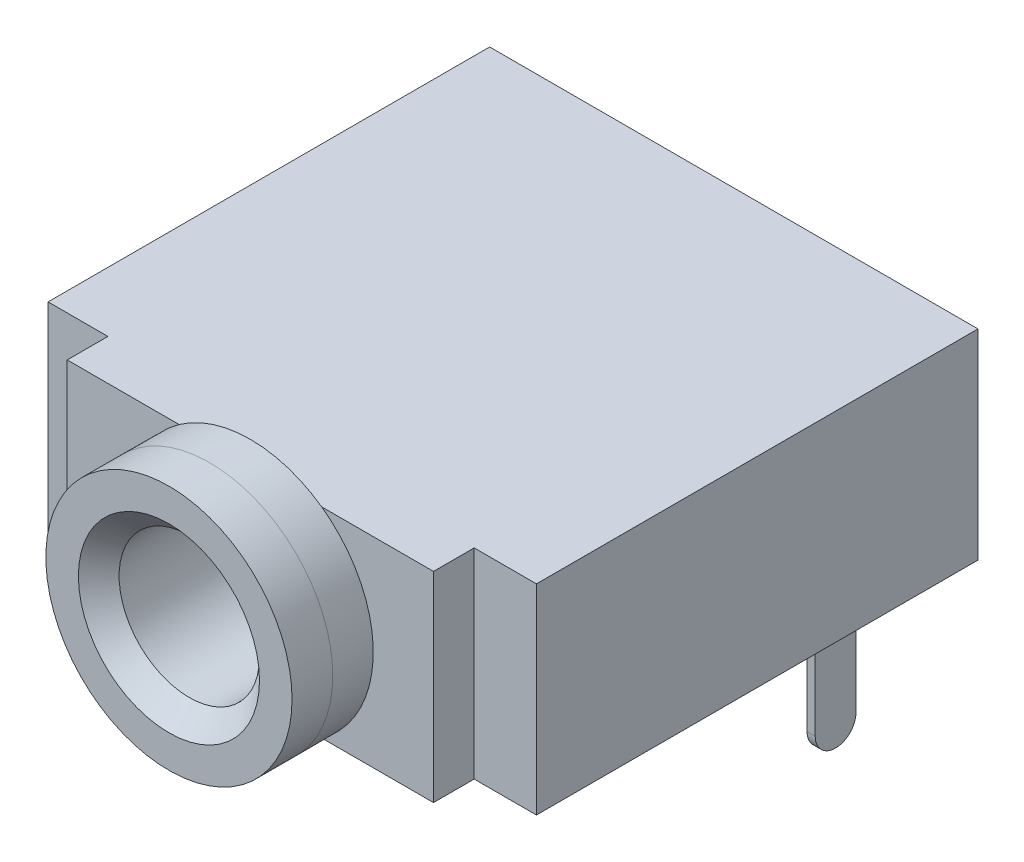
ISO-10303-21;
HEADER;
FILE_DESCRIPTION(('STEP AP214'),'2;1');
FILE_NAME('part.step','',(''),(''),'','','');
FILE_SCHEMA(('AUTOMOTIVE_DESIGN { 1 0 10303 214 1 1 1 1 }'));
ENDSEC;
DATA;
#1=APPLICATION_CONTEXT('core data for automotive mechanical design processes');
#2=APPLICATION_PROTOCOL_DEFINITION('international standard','automotive_design',2000,#1);
#3=PRODUCT_CONTEXT('',#1,'mechanical');
#4=PRODUCT('Part','Part','',(#3));
#5=PRODUCT_RELATED_PRODUCT_CATEGORY('part','',(#4));
#6=PRODUCT_DEFINITION_FORMATION('','',#4);
#7=PRODUCT_DEFINITION_CONTEXT('part definition',#1,'design');
#8=PRODUCT_DEFINITION('design','',#6,#7);
#9=PRODUCT_DEFINITION_SHAPE('','',#8);
#10=(LENGTH_UNIT() NAMED_UNIT(*) SI_UNIT(.MILLI.,.METRE.));
#11=(NAMED_UNIT(*) PLANE_ANGLE_UNIT() SI_UNIT($,.RADIAN.));
#12=(NAMED_UNIT(*) SI_UNIT($,.STERADIAN.) SOLID_ANGLE_UNIT());
#13=UNCERTAINTY_MEASURE_WITH_UNIT(LENGTH_MEASURE(1.E-05),#10,'distance_accuracy_value','');
#14=(GEOMETRIC_REPRESENTATION_CONTEXT(3) GLOBAL_UNCERTAINTY_ASSIGNED_CONTEXT((#13)) GLOBAL_UNIT_ASSIGNED_CONTEXT((#10,
#11,#12)) REPRESENTATION_CONTEXT('',''));
#15=CARTESIAN_POINT('',(0.,0.,0.));
#16=DIRECTION('',(0.,0.,1.));
#17=DIRECTION('',(1.,0.,0.));
#18=AXIS2_PLACEMENT_3D('',#15,#16,#17);
#19=CARTESIAN_POINT('',(5.48177215189873,-3.25,-3.45));
#20=DIRECTION('',(0.,0.,-1.));
#21=DIRECTION('',(-1.,0.,0.));
#22=AXIS2_PLACEMENT_3D('',#19,#20,#21);
#23=PLANE('',#22);
#24=CARTESIAN_POINT('',(5.98177215189874,-2.75,-3.45));
#25=DIRECTION('',(0.,0.,-1.));
#26=DIRECTION('',(1.,0.,0.));
#27=AXIS2_PLACEMENT_3D('',#24,#25,#26);
#28=CIRCLE('',#27,0.5);
#29=CARTESIAN_POINT('',(6.48177215189874,-2.75,-3.45));
#30=VERTEX_POINT('',#29);
#31=CARTESIAN_POINT('',(5.48177215189874,-2.75,-3.45));
#32=VERTEX_POINT('',#31);
#33=EDGE_CURVE('E253',#30,#32,#28,.T.);
#34=ORIENTED_EDGE('',*,*,#33,.F.);
#35=DIRECTION('',(0.,1.,0.));
#36=VECTOR('',#35,1.);
#37=CARTESIAN_POINT('',(6.48177215189873,-3.25,-3.45));
#38=LINE('',#37,#36);
#39=CARTESIAN_POINT('',(6.48177215189873,0.,-3.45));
#40=VERTEX_POINT('',#39);
#41=EDGE_CURVE('E260',#30,#40,#38,.T.);
#42=ORIENTED_EDGE('',*,*,#41,.T.);
#43=DIRECTION('',(-1.,0.,0.));
#44=VECTOR('',#43,1.);
#45=CARTESIAN_POINT('',(5.48177215189873,0.,-3.45));
#46=LINE('',#45,#44);
#47=CARTESIAN_POINT('',(5.48177215189873,0.,-3.45));
#48=VERTEX_POINT('',#47);
#49=EDGE_CURVE('E971',#40,#48,#46,.T.);
#50=ORIENTED_EDGE('',*,*,#49,.T.);
#51=DIRECTION('',(0.,1.,0.));
#52=VECTOR('',#51,1.);
#53=CARTESIAN_POINT('',(5.48177215189873,-3.25,-3.45));
#54=LINE('',#53,#52);
#55=EDGE_CURVE('E268',#32,#48,#54,.T.);
#56=ORIENTED_EDGE('',*,*,#55,.F.);
#57=EDGE_LOOP('',(#34,#42,#50,#56));
#58=FACE_BOUND('',#57,.T.);
#59=ADVANCED_FACE('F43',(#58),#23,.F.);
#60=CARTESIAN_POINT('',(5.48177215189873,-3.25,-3.65));
#61=DIRECTION('',(1.,0.,0.));
#62=DIRECTION('',(0.,0.,-1.));
#63=AXIS2_PLACEMENT_3D('',#60,#61,#62);
#64=PLANE('',#63);
#65=DIRECTION('',(0.,0.,1.));
#66=VECTOR('',#65,1.);
#67=CARTESIAN_POINT('',(5.48177215189874,-2.75,-10.851));
#68=LINE('',#67,#66);
#69=CARTESIAN_POINT('',(5.48177215189874,-2.75,-3.65));
#70=VERTEX_POINT('',#69);
#71=EDGE_CURVE('E249',#70,#32,#68,.T.);
#72=ORIENTED_EDGE('',*,*,#71,.T.);
#73=ORIENTED_EDGE('',*,*,#55,.T.);
#74=DIRECTION('',(0.,0.,-1.));
#75=VECTOR('',#74,1.);
#76=CARTESIAN_POINT('',(5.48177215189873,0.,-3.65));
#77=LINE('',#76,#75);
#78=CARTESIAN_POINT('',(5.48177215189873,0.,-3.65));
#79=VERTEX_POINT('',#78);
#80=EDGE_CURVE('E270',#48,#79,#77,.T.);
#81=ORIENTED_EDGE('',*,*,#80,.T.);
#82=DIRECTION('',(0.,1.,0.));
#83=VECTOR('',#82,1.);
#84=CARTESIAN_POINT('',(5.48177215189873,-3.25,-3.65));
#85=LINE('',#84,#83);
#86=EDGE_CURVE('E266',#70,#79,#85,.T.);
#87=ORIENTED_EDGE('',*,*,#86,.F.);
#88=EDGE_LOOP('',(#72,#73,#81,#87));
#89=FACE_BOUND('',#88,.T.);
#90=ADVANCED_FACE('F518',(#89),#64,.F.);
#91=CARTESIAN_POINT('',(5.48177215189873,-3.25,-3.65));
#92=DIRECTION('',(0.,0.,1.));
#93=DIRECTION('',(1.,0.,0.));
#94=AXIS2_PLACEMENT_3D('',#91,#92,#93);
#95=PLANE('',#94);
#96=DIRECTION('',(0.,1.,0.));
#97=VECTOR('',#96,1.);
#98=CARTESIAN_POINT('',(6.48177215189873,-3.25,-3.65));
#99=LINE('',#98,#97);
#100=CARTESIAN_POINT('',(6.48177215189874,-2.75,-3.65));
#101=VERTEX_POINT('',#100);
#102=CARTESIAN_POINT('',(6.48177215189873,0.,-3.65));
#103=VERTEX_POINT('',#102);
#104=EDGE_CURVE('E258',#101,#103,#99,.T.);
#105=ORIENTED_EDGE('',*,*,#104,.F.);
#106=CARTESIAN_POINT('',(5.98177215189874,-2.75,-3.65));
#107=DIRECTION('',(0.,0.,1.));
#108=DIRECTION('',(1.,0.,0.));
#109=AXIS2_PLACEMENT_3D('',#106,#107,#108);
#110=CIRCLE('',#109,0.5);
#111=EDGE_CURVE('E243',#70,#101,#110,.T.);
#112=ORIENTED_EDGE('',*,*,#111,.F.);
#113=ORIENTED_EDGE('',*,*,#86,.T.);
#114=DIRECTION('',(1.,0.,0.));
#115=VECTOR('',#114,1.);
#116=CARTESIAN_POINT('',(5.48177215189873,0.,-3.65));
#117=LINE('',#116,#115);
#118=EDGE_CURVE('E264',#79,#103,#117,.T.);
#119=ORIENTED_EDGE('',*,*,#118,.T.);
#120=EDGE_LOOP('',(#105,#112,#113,#119));
#121=FACE_BOUND('',#120,.T.);
#122=ADVANCED_FACE('F262',(#121),#95,.F.);
#123=CARTESIAN_POINT('',(0.999999999999998,-3.25,-8.85));
#124=DIRECTION('',(0.,0.,1.));
#125=DIRECTION('',(1.,0.,0.));
#126=AXIS2_PLACEMENT_3D('',#123,#124,#125);
#127=PLANE('',#126);
#128=DIRECTION('',(-1.,0.,0.));
#129=VECTOR('',#128,1.);
#130=CARTESIAN_POINT('',(12.,-2.75,-8.85));
#131=LINE('',#130,#129);
#132=CARTESIAN_POINT('',(1.2,-2.75,-8.85));
#133=VERTEX_POINT('',#132);
#134=CARTESIAN_POINT('',(0.999999999999998,-2.75,-8.85));
#135=VERTEX_POINT('',#134);
#136=EDGE_CURVE('E948',#133,#135,#131,.T.);
#137=ORIENTED_EDGE('',*,*,#136,.T.);
#138=DIRECTION('',(0.,1.,0.));
#139=VECTOR('',#138,1.);
#140=CARTESIAN_POINT('',(0.999999999999998,-3.25,-8.85));
#141=LINE('',#140,#139);
#142=CARTESIAN_POINT('',(0.999999999999998,0.,-8.85));
#143=VERTEX_POINT('',#142);
#144=EDGE_CURVE('E350',#135,#143,#141,.T.);
#145=ORIENTED_EDGE('',*,*,#144,.T.);
#146=DIRECTION('',(1.,0.,0.));
#147=VECTOR('',#146,1.);
#148=CARTESIAN_POINT('',(0.999999999999998,0.,-8.85));
#149=LINE('',#148,#147);
#150=CARTESIAN_POINT('',(1.2,0.,-8.85));
#151=VERTEX_POINT('',#150);
#152=EDGE_CURVE('E345',#143,#151,#149,.T.);
#153=ORIENTED_EDGE('',*,*,#152,.T.);
#154=DIRECTION('',(0.,1.,0.));
#155=VECTOR('',#154,1.);
#156=CARTESIAN_POINT('',(1.2,-3.25,-8.85));
#157=LINE('',#156,#155);
#158=EDGE_CURVE('E348',#133,#151,#157,.T.);
#159=ORIENTED_EDGE('',*,*,#158,.F.);
#160=EDGE_LOOP('',(#137,#145,#153,#159));
#161=FACE_BOUND('',#160,.T.);
#162=ADVANCED_FACE('F568',(#161),#127,.F.);
#163=CARTESIAN_POINT('',(3.5,-3.25,-8.85));
#164=DIRECTION('',(0.,0.,1.));
#165=DIRECTION('',(1.,0.,0.));
#166=AXIS2_PLACEMENT_3D('',#163,#164,#165);
#167=PLANE('',#166);
#168=CARTESIAN_POINT('',(3.7,-2.75,-8.85));
#169=VERTEX_POINT('',#168);
#170=CARTESIAN_POINT('',(3.5,-2.75,-8.85));
#171=VERTEX_POINT('',#170);
#172=EDGE_CURVE('E950',#169,#171,#131,.T.);
#173=ORIENTED_EDGE('',*,*,#172,.T.);
#174=DIRECTION('',(0.,1.,0.));
#175=VECTOR('',#174,1.);
#176=CARTESIAN_POINT('',(3.5,-3.25,-8.85));
#177=LINE('',#176,#175);
#178=CARTESIAN_POINT('',(3.5,0.,-8.85));
#179=VERTEX_POINT('',#178);
#180=EDGE_CURVE('E330',#171,#179,#177,.T.);
#181=ORIENTED_EDGE('',*,*,#180,.T.);
#182=DIRECTION('',(1.,0.,0.));
#183=VECTOR('',#182,1.);
#184=CARTESIAN_POINT('',(3.5,0.,-8.85));
#185=LINE('',#184,#183);
#186=CARTESIAN_POINT('',(3.7,0.,-8.85));
#187=VERTEX_POINT('',#186);
#188=EDGE_CURVE('E325',#179,#187,#185,.T.);
#189=ORIENTED_EDGE('',*,*,#188,.T.);
#190=DIRECTION('',(0.,1.,0.));
#191=VECTOR('',#190,1.);
#192=CARTESIAN_POINT('',(3.7,-3.25,-8.85));
#193=LINE('',#192,#191);
#194=EDGE_CURVE('E328',#169,#187,#193,.T.);
#195=ORIENTED_EDGE('',*,*,#194,.F.);
#196=EDGE_LOOP('',(#173,#181,#189,#195));
#197=FACE_BOUND('',#196,.T.);
#198=ADVANCED_FACE('F552',(#197),#167,.F.);
#199=CARTESIAN_POINT('',(8.5,-3.25,-8.85));
#200=DIRECTION('',(0.,0.,1.));
#201=DIRECTION('',(1.,0.,0.));
#202=AXIS2_PLACEMENT_3D('',#199,#200,#201);
#203=PLANE('',#202);
#204=CARTESIAN_POINT('',(8.5,-2.75,-8.85));
#205=VERTEX_POINT('',#204);
#206=CARTESIAN_POINT('',(8.3,-2.75,-8.85));
#207=VERTEX_POINT('',#206);
#208=EDGE_CURVE('E1008',#205,#207,#131,.T.);
#209=ORIENTED_EDGE('',*,*,#208,.T.);
#210=DIRECTION('',(0.,1.,0.));
#211=VECTOR('',#210,1.);
#212=CARTESIAN_POINT('',(8.3,-3.25,-8.85));
#213=LINE('',#212,#211);
#214=CARTESIAN_POINT('',(8.3,0.,-8.85));
#215=VERTEX_POINT('',#214);
#216=EDGE_CURVE('E310',#207,#215,#213,.T.);
#217=ORIENTED_EDGE('',*,*,#216,.T.);
#218=DIRECTION('',(1.,0.,0.));
#219=VECTOR('',#218,1.);
#220=CARTESIAN_POINT('',(8.5,0.,-8.85));
#221=LINE('',#220,#219);
#222=CARTESIAN_POINT('',(8.5,0.,-8.85));
#223=VERTEX_POINT('',#222);
#224=EDGE_CURVE('E305',#215,#223,#221,.T.);
#225=ORIENTED_EDGE('',*,*,#224,.T.);
#226=DIRECTION('',(0.,1.,0.));
#227=VECTOR('',#226,1.);
#228=CARTESIAN_POINT('',(8.5,-3.25,-8.85));
#229=LINE('',#228,#227);
#230=EDGE_CURVE('E308',#205,#223,#229,.T.);
#231=ORIENTED_EDGE('',*,*,#230,.F.);
#232=EDGE_LOOP('',(#209,#217,#225,#231));
#233=FACE_BOUND('',#232,.T.);
#234=ADVANCED_FACE('F536',(#233),#203,.F.);
#235=CARTESIAN_POINT('',(11.,-3.25,-8.85));
#236=DIRECTION('',(0.,0.,1.));
#237=DIRECTION('',(1.,0.,0.));
#238=AXIS2_PLACEMENT_3D('',#235,#236,#237);
#239=PLANE('',#238);
#240=CARTESIAN_POINT('',(11.,-2.75,-8.85));
#241=VERTEX_POINT('',#240);
#242=CARTESIAN_POINT('',(10.8,-2.75,-8.85));
#243=VERTEX_POINT('',#242);
#244=EDGE_CURVE('E941',#241,#243,#131,.T.);
#245=ORIENTED_EDGE('',*,*,#244,.T.);
#246=DIRECTION('',(0.,1.,0.));
#247=VECTOR('',#246,1.);
#248=CARTESIAN_POINT('',(10.8,-3.25,-8.85));
#249=LINE('',#248,#247);
#250=CARTESIAN_POINT('',(10.8,0.,-8.85));
#251=VERTEX_POINT('',#250);
#252=EDGE_CURVE('E290',#243,#251,#249,.T.);
#253=ORIENTED_EDGE('',*,*,#252,.T.);
#254=DIRECTION('',(1.,0.,0.));
#255=VECTOR('',#254,1.);
#256=CARTESIAN_POINT('',(11.,0.,-8.85));
#257=LINE('',#256,#255);
#258=CARTESIAN_POINT('',(11.,0.,-8.85));
#259=VERTEX_POINT('',#258);
#260=EDGE_CURVE('E285',#251,#259,#257,.T.);
#261=ORIENTED_EDGE('',*,*,#260,.T.);
#262=DIRECTION('',(0.,1.,0.));
#263=VECTOR('',#262,1.);
#264=CARTESIAN_POINT('',(11.,-3.25,-8.85));
#265=LINE('',#264,#263);
#266=EDGE_CURVE('E288',#241,#259,#265,.T.);
#267=ORIENTED_EDGE('',*,*,#266,.F.);
#268=EDGE_LOOP('',(#245,#253,#261,#267));
#269=FACE_BOUND('',#268,.T.);
#270=ADVANCED_FACE('F533',(#269),#239,.F.);
#271=CARTESIAN_POINT('',(0.,0.,0.));
#272=DIRECTION('',(0.,-1.,0.));
#273=DIRECTION('',(0.,0.,-1.));
#274=AXIS2_PLACEMENT_3D('',#271,#272,#273);
#275=PLANE('',#274);
#276=DIRECTION('',(0.,0.,1.));
#277=VECTOR('',#276,1.);
#278=CARTESIAN_POINT('',(0.,0.,0.));
#279=LINE('',#278,#277);
#280=CARTESIAN_POINT('',(0.,0.,-10.85));
#281=VERTEX_POINT('',#280);
#282=CARTESIAN_POINT('',(0.,0.,0.));
#283=VERTEX_POINT('',#282);
#284=EDGE_CURVE('E447',#281,#283,#279,.T.);
#285=ORIENTED_EDGE('',*,*,#284,.F.);
#286=DIRECTION('',(-1.,0.,0.));
#287=VECTOR('',#286,1.);
#288=CARTESIAN_POINT('',(0.,0.,-10.85));
#289=LINE('',#288,#287);
#290=CARTESIAN_POINT('',(12.,0.,-10.85));
#291=VERTEX_POINT('',#290);
#292=EDGE_CURVE('E452',#291,#281,#289,.T.);
#293=ORIENTED_EDGE('',*,*,#292,.F.);
#294=DIRECTION('',(0.,0.,-1.));
#295=VECTOR('',#294,1.);
#296=CARTESIAN_POINT('',(12.,0.,0.));
#297=LINE('',#296,#295);
#298=CARTESIAN_POINT('',(12.,0.,0.));
#299=VERTEX_POINT('',#298);
#300=EDGE_CURVE('E466',#299,#291,#297,.T.);
#301=ORIENTED_EDGE('',*,*,#300,.F.);
#302=DIRECTION('',(1.,0.,0.));
#303=VECTOR('',#302,1.);
#304=CARTESIAN_POINT('',(0.,0.,0.));
#305=LINE('',#304,#303);
#306=CARTESIAN_POINT('',(10.47,0.,0.));
#307=VERTEX_POINT('',#306);
#308=EDGE_CURVE('E463',#307,#299,#305,.T.);
#309=ORIENTED_EDGE('',*,*,#308,.F.);
#310=DIRECTION('',(0.,0.,-1.));
#311=VECTOR('',#310,1.);
#312=CARTESIAN_POINT('',(10.47,0.,1.));
#313=LINE('',#312,#311);
#314=CARTESIAN_POINT('',(10.47,0.,1.));
#315=VERTEX_POINT('',#314);
#316=EDGE_CURVE('E441',#315,#307,#313,.T.);
#317=ORIENTED_EDGE('',*,*,#316,.F.);
#318=DIRECTION('',(1.,0.,0.));
#319=VECTOR('',#318,1.);
#320=CARTESIAN_POINT('',(10.47,0.,1.));
#321=LINE('',#320,#319);
#322=CARTESIAN_POINT('',(7.72179907523665,0.,1.));
#323=VERTEX_POINT('',#322);
#324=EDGE_CURVE('E497',#323,#315,#321,.T.);
#325=ORIENTED_EDGE('',*,*,#324,.F.);
#326=CARTESIAN_POINT('',(4.21820092476335,0.,1.));
#327=VERTEX_POINT('',#326);
#328=EDGE_CURVE('E498',#327,#323,#321,.T.);
#329=ORIENTED_EDGE('',*,*,#328,.F.);
#330=CARTESIAN_POINT('',(1.47,0.,1.));
#331=VERTEX_POINT('',#330);
#332=EDGE_CURVE('E491',#331,#327,#321,.T.);
#333=ORIENTED_EDGE('',*,*,#332,.F.);
#334=DIRECTION('',(0.,0.,-1.));
#335=VECTOR('',#334,1.);
#336=CARTESIAN_POINT('',(1.47,0.,1.));
#337=LINE('',#336,#335);
#338=CARTESIAN_POINT('',(1.47,0.,0.));
#339=VERTEX_POINT('',#338);
#340=EDGE_CURVE('E444',#331,#339,#337,.T.);
#341=ORIENTED_EDGE('',*,*,#340,.T.);
#342=EDGE_CURVE('E464',#283,#339,#305,.T.);
#343=ORIENTED_EDGE('',*,*,#342,.F.);
#344=EDGE_LOOP('',(#285,#293,#301,#309,#317,#325,#329,#333,#341,#343));
#345=FACE_BOUND('',#344,.T.);
#346=DIRECTION('',(-1.,0.,0.));
#347=VECTOR('',#346,1.);
#348=CARTESIAN_POINT('',(0.999999999999999,0.,-7.85));
#349=LINE('',#348,#347);
#350=CARTESIAN_POINT('',(1.2,0.,-7.85));
#351=VERTEX_POINT('',#350);
#352=CARTESIAN_POINT('',(0.999999999999999,0.,-7.85));
#353=VERTEX_POINT('',#352);
#354=EDGE_CURVE('E339',#351,#353,#349,.T.);
#355=ORIENTED_EDGE('',*,*,#354,.F.);
#356=DIRECTION('',(0.,0.,1.));
#357=VECTOR('',#356,1.);
#358=CARTESIAN_POINT('',(1.2,0.,-8.85));
#359=LINE('',#358,#357);
#360=EDGE_CURVE('E336',#151,#351,#359,.T.);
#361=ORIENTED_EDGE('',*,*,#360,.F.);
#362=ORIENTED_EDGE('',*,*,#152,.F.);
#363=DIRECTION('',(0.,0.,-1.));
#364=VECTOR('',#363,1.);
#365=CARTESIAN_POINT('',(0.999999999999998,0.,-8.85));
#366=LINE('',#365,#364);
#367=EDGE_CURVE('E342',#353,#143,#366,.T.);
#368=ORIENTED_EDGE('',*,*,#367,.F.);
#369=EDGE_LOOP('',(#355,#361,#362,#368));
#370=FACE_BOUND('',#369,.T.);
#371=DIRECTION('',(-1.,0.,0.));
#372=VECTOR('',#371,1.);
#373=CARTESIAN_POINT('',(3.5,0.,-7.85));
#374=LINE('',#373,#372);
#375=CARTESIAN_POINT('',(3.7,0.,-7.85));
#376=VERTEX_POINT('',#375);
#377=CARTESIAN_POINT('',(3.5,0.,-7.85));
#378=VERTEX_POINT('',#377);
#379=EDGE_CURVE('E319',#376,#378,#374,.T.);
#380=ORIENTED_EDGE('',*,*,#379,.F.);
#381=DIRECTION('',(0.,0.,1.));
#382=VECTOR('',#381,1.);
#383=CARTESIAN_POINT('',(3.7,0.,-8.85));
#384=LINE('',#383,#382);
#385=EDGE_CURVE('E316',#187,#376,#384,.T.);
#386=ORIENTED_EDGE('',*,*,#385,.F.);
#387=ORIENTED_EDGE('',*,*,#188,.F.);
#388=DIRECTION('',(0.,0.,-1.));
#389=VECTOR('',#388,1.);
#390=CARTESIAN_POINT('',(3.5,0.,-8.85));
#391=LINE('',#390,#389);
#392=EDGE_CURVE('E322',#378,#179,#391,.T.);
#393=ORIENTED_EDGE('',*,*,#392,.F.);
#394=EDGE_LOOP('',(#380,#386,#387,#393));
#395=FACE_BOUND('',#394,.T.);
#396=DIRECTION('',(-1.,0.,0.));
#397=VECTOR('',#396,1.);
#398=CARTESIAN_POINT('',(8.5,0.,-7.85));
#399=LINE('',#398,#397);
#400=CARTESIAN_POINT('',(8.5,0.,-7.85));
#401=VERTEX_POINT('',#400);
#402=CARTESIAN_POINT('',(8.3,0.,-7.85));
#403=VERTEX_POINT('',#402);
#404=EDGE_CURVE('E299',#401,#403,#399,.T.);
#405=ORIENTED_EDGE('',*,*,#404,.F.);
#406=DIRECTION('',(0.,0.,1.));
#407=VECTOR('',#406,1.);
#408=CARTESIAN_POINT('',(8.5,0.,-8.85));
#409=LINE('',#408,#407);
#410=EDGE_CURVE('E296',#223,#401,#409,.T.);
#411=ORIENTED_EDGE('',*,*,#410,.F.);
#412=ORIENTED_EDGE('',*,*,#224,.F.);
#413=DIRECTION('',(0.,0.,-1.));
#414=VECTOR('',#413,1.);
#415=CARTESIAN_POINT('',(8.3,0.,-8.85));
#416=LINE('',#415,#414);
#417=EDGE_CURVE('E302',#403,#215,#416,.T.);
#418=ORIENTED_EDGE('',*,*,#417,.F.);
#419=EDGE_LOOP('',(#405,#411,#412,#418));
#420=FACE_BOUND('',#419,.T.);
#421=DIRECTION('',(-1.,0.,0.));
#422=VECTOR('',#421,1.);
#423=CARTESIAN_POINT('',(11.,0.,-7.85));
#424=LINE('',#423,#422);
#425=CARTESIAN_POINT('',(11.,0.,-7.85));
#426=VERTEX_POINT('',#425);
#427=CARTESIAN_POINT('',(10.8,0.,-7.85));
#428=VERTEX_POINT('',#427);
#429=EDGE_CURVE('E279',#426,#428,#424,.T.);
#430=ORIENTED_EDGE('',*,*,#429,.F.);
#431=DIRECTION('',(0.,0.,1.));
#432=VECTOR('',#431,1.);
#433=CARTESIAN_POINT('',(11.,0.,-8.85));
#434=LINE('',#433,#432);
#435=EDGE_CURVE('E276',#259,#426,#434,.T.);
#436=ORIENTED_EDGE('',*,*,#435,.F.);
#437=ORIENTED_EDGE('',*,*,#260,.F.);
#438=DIRECTION('',(0.,0.,-1.));
#439=VECTOR('',#438,1.);
#440=CARTESIAN_POINT('',(10.8,0.,-8.85));
#441=LINE('',#440,#439);
#442=EDGE_CURVE('E282',#428,#251,#441,.T.);
#443=ORIENTED_EDGE('',*,*,#442,.F.);
#444=EDGE_LOOP('',(#430,#436,#437,#443));
#445=FACE_BOUND('',#444,.T.);
#446=ORIENTED_EDGE('',*,*,#49,.F.);
#447=DIRECTION('',(0.,0.,1.));
#448=VECTOR('',#447,1.);
#449=CARTESIAN_POINT('',(6.48177215189873,0.,-3.65));
#450=LINE('',#449,#448);
#451=EDGE_CURVE('E969',#103,#40,#450,.T.);
#452=ORIENTED_EDGE('',*,*,#451,.F.);
#453=ORIENTED_EDGE('',*,*,#118,.F.);
#454=ORIENTED_EDGE('',*,*,#80,.F.);
#455=EDGE_LOOP('',(#446,#452,#453,#454));
#456=FACE_BOUND('',#455,.T.);
#457=ADVANCED_FACE('F487',(#345,#370,#395,#420,#445,#456),#275,.T.);
#458=CARTESIAN_POINT('',(0.,0.,1.));
#459=DIRECTION('',(0.,0.,-1.));
#460=DIRECTION('',(-1.,0.,0.));
#461=AXIS2_PLACEMENT_3D('',#458,#459,#460);
#462=PLANE('',#461);
#463=CARTESIAN_POINT('',(5.97,2.46,1.));
#464=DIRECTION('',(0.,0.,1.));
#465=DIRECTION('',(1.,0.,0.));
#466=AXIS2_PLACEMENT_3D('',#463,#464,#465);
#467=CIRCLE('',#466,3.02);
#468=CARTESIAN_POINT('',(4.21820092476335,4.92,1.));
#469=VERTEX_POINT('',#468);
#470=EDGE_CURVE('E410',#469,#327,#467,.T.);
#471=ORIENTED_EDGE('',*,*,#470,.F.);
#472=DIRECTION('',(-1.,0.,0.));
#473=VECTOR('',#472,1.);
#474=CARTESIAN_POINT('',(10.47,4.92,1.));
#475=LINE('',#474,#473);
#476=CARTESIAN_POINT('',(1.47,4.92,1.));
#477=VERTEX_POINT('',#476);
#478=EDGE_CURVE('E501',#469,#477,#475,.T.);
#479=ORIENTED_EDGE('',*,*,#478,.T.);
#480=DIRECTION('',(0.,-1.,0.));
#481=VECTOR('',#480,1.);
#482=CARTESIAN_POINT('',(1.47,4.92,1.));
#483=LINE('',#482,#481);
#484=EDGE_CURVE('E430',#477,#331,#483,.T.);
#485=ORIENTED_EDGE('',*,*,#484,.T.);
#486=ORIENTED_EDGE('',*,*,#332,.T.);
#487=EDGE_LOOP('',(#471,#479,#485,#486));
#488=FACE_BOUND('',#487,.T.);
#489=ADVANCED_FACE('F624',(#488),#462,.F.);
#490=CARTESIAN_POINT('',(0.,4.92,0.));
#491=DIRECTION('',(0.,0.,-1.));
#492=DIRECTION('',(-1.,0.,0.));
#493=AXIS2_PLACEMENT_3D('',#490,#491,#492);
#494=PLANE('',#493);
#495=DIRECTION('',(0.,-1.,0.));
#496=VECTOR('',#495,1.);
#497=CARTESIAN_POINT('',(1.47,4.92,0.));
#498=LINE('',#497,#496);
#499=CARTESIAN_POINT('',(1.47,4.92,0.));
#500=VERTEX_POINT('',#499);
#501=EDGE_CURVE('E422',#500,#339,#498,.T.);
#502=ORIENTED_EDGE('',*,*,#501,.F.);
#503=DIRECTION('',(1.,0.,0.));
#504=VECTOR('',#503,1.);
#505=CARTESIAN_POINT('',(0.,4.92,0.));
#506=LINE('',#505,#504);
#507=CARTESIAN_POINT('',(0.,4.92,0.));
#508=VERTEX_POINT('',#507);
#509=EDGE_CURVE('E453',#508,#500,#506,.T.);
#510=ORIENTED_EDGE('',*,*,#509,.F.);
#511=DIRECTION('',(0.,-1.,0.));
#512=VECTOR('',#511,1.);
#513=CARTESIAN_POINT('',(0.,4.92,0.));
#514=LINE('',#513,#512);
#515=EDGE_CURVE('E419',#508,#283,#514,.T.);
#516=ORIENTED_EDGE('',*,*,#515,.T.);
#517=ORIENTED_EDGE('',*,*,#342,.T.);
#518=EDGE_LOOP('',(#502,#510,#516,#517));
#519=FACE_BOUND('',#518,.T.);
#520=ADVANCED_FACE('F479',(#519),#494,.F.);
#521=DIRECTION('',(0.,1.,0.));
#522=VECTOR('',#521,1.);
#523=CARTESIAN_POINT('',(10.47,4.92,0.));
#524=LINE('',#523,#522);
#525=CARTESIAN_POINT('',(10.47,4.92,0.));
#526=VERTEX_POINT('',#525);
#527=EDGE_CURVE('E424',#307,#526,#524,.T.);
#528=ORIENTED_EDGE('',*,*,#527,.F.);
#529=ORIENTED_EDGE('',*,*,#308,.T.);
#530=DIRECTION('',(0.,-1.,0.));
#531=VECTOR('',#530,1.);
#532=CARTESIAN_POINT('',(12.,4.92,0.));
#533=LINE('',#532,#531);
#534=CARTESIAN_POINT('',(12.,4.92,0.));
#535=VERTEX_POINT('',#534);
#536=EDGE_CURVE('E474',#535,#299,#533,.T.);
#537=ORIENTED_EDGE('',*,*,#536,.F.);
#538=EDGE_CURVE('E451',#526,#535,#506,.T.);
#539=ORIENTED_EDGE('',*,*,#538,.F.);
#540=EDGE_LOOP('',(#528,#529,#537,#539));
#541=FACE_BOUND('',#540,.T.);
#542=ADVANCED_FACE('F711',(#541),#494,.F.);
#543=CARTESIAN_POINT('',(0.,4.92,0.));
#544=DIRECTION('',(1.,0.,0.));
#545=DIRECTION('',(0.,0.,-1.));
#546=AXIS2_PLACEMENT_3D('',#543,#544,#545);
#547=PLANE('',#546);
#548=ORIENTED_EDGE('',*,*,#284,.T.);
#549=ORIENTED_EDGE('',*,*,#515,.F.);
#550=DIRECTION('',(0.,0.,1.));
#551=VECTOR('',#550,1.);
#552=CARTESIAN_POINT('',(0.,4.92,0.));
#553=LINE('',#552,#551);
#554=CARTESIAN_POINT('',(0.,4.92,-10.85));
#555=VERTEX_POINT('',#554);
#556=EDGE_CURVE('E448',#555,#508,#553,.T.);
#557=ORIENTED_EDGE('',*,*,#556,.F.);
#558=DIRECTION('',(0.,-1.,0.));
#559=VECTOR('',#558,1.);
#560=CARTESIAN_POINT('',(0.,4.92,-10.85));
#561=LINE('',#560,#559);
#562=EDGE_CURVE('E460',#555,#281,#561,.T.);
#563=ORIENTED_EDGE('',*,*,#562,.T.);
#564=EDGE_LOOP('',(#548,#549,#557,#563));
#565=FACE_BOUND('',#564,.T.);
#566=ADVANCED_FACE('F483',(#565),#547,.F.);
#567=CARTESIAN_POINT('',(12.,4.92,0.));
#568=DIRECTION('',(-1.,0.,0.));
#569=DIRECTION('',(0.,0.,1.));
#570=AXIS2_PLACEMENT_3D('',#567,#568,#569);
#571=PLANE('',#570);
#572=ORIENTED_EDGE('',*,*,#300,.T.);
#573=DIRECTION('',(0.,-1.,0.));
#574=VECTOR('',#573,1.);
#575=CARTESIAN_POINT('',(12.,4.92,-10.85));
#576=LINE('',#575,#574);
#577=CARTESIAN_POINT('',(12.,4.92,-10.85));
#578=VERTEX_POINT('',#577);
#579=EDGE_CURVE('E471',#578,#291,#576,.T.);
#580=ORIENTED_EDGE('',*,*,#579,.F.);
#581=DIRECTION('',(0.,0.,-1.));
#582=VECTOR('',#581,1.);
#583=CARTESIAN_POINT('',(12.,4.92,0.));
#584=LINE('',#583,#582);
#585=EDGE_CURVE('E456',#535,#578,#584,.T.);
#586=ORIENTED_EDGE('',*,*,#585,.F.);
#587=ORIENTED_EDGE('',*,*,#536,.T.);
#588=EDGE_LOOP('',(#572,#580,#586,#587));
#589=FACE_BOUND('',#588,.T.);
#590=ADVANCED_FACE('F726',(#589),#571,.F.);
#591=CARTESIAN_POINT('',(0.,4.92,-10.85));
#592=DIRECTION('',(0.,0.,1.));
#593=DIRECTION('',(1.,0.,0.));
#594=AXIS2_PLACEMENT_3D('',#591,#592,#593);
#595=PLANE('',#594);
#596=ORIENTED_EDGE('',*,*,#292,.T.);
#597=ORIENTED_EDGE('',*,*,#562,.F.);
#598=DIRECTION('',(-1.,0.,0.));
#599=VECTOR('',#598,1.);
#600=CARTESIAN_POINT('',(0.,4.92,-10.85));
#601=LINE('',#600,#599);
#602=EDGE_CURVE('E458',#578,#555,#601,.T.);
#603=ORIENTED_EDGE('',*,*,#602,.F.);
#604=ORIENTED_EDGE('',*,*,#579,.T.);
#605=EDGE_LOOP('',(#596,#597,#603,#604));
#606=FACE_BOUND('',#605,.T.);
#607=ADVANCED_FACE('F700',(#606),#595,.F.);
#608=CARTESIAN_POINT('',(0.,4.92,0.));
#609=DIRECTION('',(0.,-1.,0.));
#610=DIRECTION('',(0.,0.,-1.));
#611=AXIS2_PLACEMENT_3D('',#608,#609,#610);
#612=PLANE('',#611);
#613=ORIENTED_EDGE('',*,*,#556,.T.);
#614=ORIENTED_EDGE('',*,*,#509,.T.);
#615=DIRECTION('',(0.,0.,-1.));
#616=VECTOR('',#615,1.);
#617=CARTESIAN_POINT('',(1.47,4.92,1.));
#618=LINE('',#617,#616);
#619=EDGE_CURVE('E436',#477,#500,#618,.T.);
#620=ORIENTED_EDGE('',*,*,#619,.F.);
#621=ORIENTED_EDGE('',*,*,#478,.F.);
#622=CARTESIAN_POINT('',(7.72179907523665,4.92,1.));
#623=VERTEX_POINT('',#622);
#624=EDGE_CURVE('E505',#623,#469,#475,.T.);
#625=ORIENTED_EDGE('',*,*,#624,.F.);
#626=CARTESIAN_POINT('',(10.47,4.92,1.));
#627=VERTEX_POINT('',#626);
#628=EDGE_CURVE('E433',#627,#623,#475,.T.);
#629=ORIENTED_EDGE('',*,*,#628,.F.);
#630=DIRECTION('',(0.,0.,-1.));
#631=VECTOR('',#630,1.);
#632=CARTESIAN_POINT('',(10.47,4.92,1.));
#633=LINE('',#632,#631);
#634=EDGE_CURVE('E438',#627,#526,#633,.T.);
#635=ORIENTED_EDGE('',*,*,#634,.T.);
#636=ORIENTED_EDGE('',*,*,#538,.T.);
#637=ORIENTED_EDGE('',*,*,#585,.T.);
#638=ORIENTED_EDGE('',*,*,#602,.T.);
#639=EDGE_LOOP('',(#613,#614,#620,#621,#625,#629,#635,#636,#637,#638));
#640=FACE_BOUND('',#639,.T.);
#641=ADVANCED_FACE('F512',(#640),#612,.F.);
#642=CARTESIAN_POINT('',(1.47,4.92,1.));
#643=DIRECTION('',(1.,0.,0.));
#644=DIRECTION('',(0.,1.,0.));
#645=AXIS2_PLACEMENT_3D('',#642,#643,#644);
#646=PLANE('',#645);
#647=ORIENTED_EDGE('',*,*,#501,.T.);
#648=ORIENTED_EDGE('',*,*,#340,.F.);
#649=ORIENTED_EDGE('',*,*,#484,.F.);
#650=ORIENTED_EDGE('',*,*,#619,.T.);
#651=EDGE_LOOP('',(#647,#648,#649,#650));
#652=FACE_BOUND('',#651,.T.);
#653=ADVANCED_FACE('F494',(#652),#646,.F.);
#654=CARTESIAN_POINT('',(10.47,4.92,1.));
#655=DIRECTION('',(-1.,0.,0.));
#656=DIRECTION('',(0.,0.,1.));
#657=AXIS2_PLACEMENT_3D('',#654,#655,#656);
#658=PLANE('',#657);
#659=ORIENTED_EDGE('',*,*,#527,.T.);
#660=ORIENTED_EDGE('',*,*,#634,.F.);
#661=DIRECTION('',(0.,1.,0.));
#662=VECTOR('',#661,1.);
#663=CARTESIAN_POINT('',(10.47,4.92,1.));
#664=LINE('',#663,#662);
#665=EDGE_CURVE('E500',#315,#627,#664,.T.);
#666=ORIENTED_EDGE('',*,*,#665,.F.);
#667=ORIENTED_EDGE('',*,*,#316,.T.);
#668=EDGE_LOOP('',(#659,#660,#666,#667));
#669=FACE_BOUND('',#668,.T.);
#670=ADVANCED_FACE('F679',(#669),#658,.F.);
#671=EDGE_CURVE('E414',#323,#623,#467,.T.);
#672=ORIENTED_EDGE('',*,*,#671,.F.);
#673=ORIENTED_EDGE('',*,*,#324,.T.);
#674=ORIENTED_EDGE('',*,*,#665,.T.);
#675=ORIENTED_EDGE('',*,*,#628,.T.);
#676=EDGE_LOOP('',(#672,#673,#674,#675));
#677=FACE_BOUND('',#676,.T.);
#678=ADVANCED_FACE('F392',(#677),#462,.F.);
#679=CARTESIAN_POINT('',(5.97,2.46,1.));
#680=DIRECTION('',(0.,0.,1.));
#681=DIRECTION('',(1.,0.,0.));
#682=AXIS2_PLACEMENT_3D('',#679,#680,#681);
#683=PLANE('',#682);
#684=EDGE_CURVE('E362',#327,#323,#467,.T.);
#685=ORIENTED_EDGE('',*,*,#684,.F.);
#686=ORIENTED_EDGE('',*,*,#328,.T.);
#687=EDGE_LOOP('',(#685,#686));
#688=FACE_BOUND('',#687,.T.);
#689=ADVANCED_FACE('F388',(#688),#683,.F.);
#690=EDGE_CURVE('E372',#623,#469,#467,.T.);
#691=ORIENTED_EDGE('',*,*,#690,.F.);
#692=ORIENTED_EDGE('',*,*,#624,.T.);
#693=EDGE_LOOP('',(#691,#692));
#694=FACE_BOUND('',#693,.T.);
#695=ADVANCED_FACE('F391',(#694),#683,.F.);
#696=CARTESIAN_POINT('',(5.97,2.46,2.));
#697=DIRECTION('',(0.,0.,-1.));
#698=DIRECTION('',(-1.,0.,0.));
#699=AXIS2_PLACEMENT_3D('',#696,#697,#698);
#700=CYLINDRICAL_SURFACE('',#699,3.02);
#701=CARTESIAN_POINT('',(5.97,2.46,2.));
#702=DIRECTION('',(0.,0.,1.));
#703=DIRECTION('',(1.,0.,0.));
#704=AXIS2_PLACEMENT_3D('',#701,#702,#703);
#705=CIRCLE('',#704,3.025);
#706=CARTESIAN_POINT('',(8.995,2.46,2.));
#707=VERTEX_POINT('',#706);
#708=EDGE_CURVE('E367',#707,#707,#705,.T.);
#709=ORIENTED_EDGE('',*,*,#708,.F.);
#710=EDGE_LOOP('',(#709));
#711=FACE_BOUND('',#710,.T.);
#712=ORIENTED_EDGE('',*,*,#690,.T.);
#713=ORIENTED_EDGE('',*,*,#470,.T.);
#714=ORIENTED_EDGE('',*,*,#684,.T.);
#715=ORIENTED_EDGE('',*,*,#671,.T.);
#716=EDGE_LOOP('',(#712,#713,#714,#715));
#717=FACE_BOUND('',#716,.T.);
#718=ADVANCED_FACE('F385',(#711,#717),#700,.T.);
#719=CARTESIAN_POINT('',(5.97,2.46,3.));
#720=DIRECTION('',(0.,0.,-1.));
#721=DIRECTION('',(-1.,0.,0.));
#722=AXIS2_PLACEMENT_3D('',#719,#720,#721);
#723=CYLINDRICAL_SURFACE('',#722,3.025);
#724=CARTESIAN_POINT('',(5.97,2.46,3.));
#725=DIRECTION('',(0.,0.,1.));
#726=DIRECTION('',(1.,0.,0.));
#727=AXIS2_PLACEMENT_3D('',#724,#725,#726);
#728=CIRCLE('',#727,3.025);
#729=CARTESIAN_POINT('',(8.995,2.46,3.));
#730=VERTEX_POINT('',#729);
#731=EDGE_CURVE('E359',#730,#730,#728,.T.);
#732=ORIENTED_EDGE('',*,*,#731,.F.);
#733=EDGE_LOOP('',(#732));
#734=FACE_BOUND('',#733,.T.);
#735=ORIENTED_EDGE('',*,*,#708,.T.);
#736=EDGE_LOOP('',(#735));
#737=FACE_BOUND('',#736,.T.);
#738=ADVANCED_FACE('F374',(#734,#737),#723,.T.);
#739=CARTESIAN_POINT('',(5.97,2.46,3.));
#740=DIRECTION('',(0.,0.,1.));
#741=DIRECTION('',(1.,0.,0.));
#742=AXIS2_PLACEMENT_3D('',#739,#740,#741);
#743=PLANE('',#742);
#744=CARTESIAN_POINT('',(5.97,2.46,3.));
#745=DIRECTION('',(0.,0.,1.));
#746=DIRECTION('',(1.,0.,0.));
#747=AXIS2_PLACEMENT_3D('',#744,#745,#746);
#748=CIRCLE('',#747,2.225);
#749=CARTESIAN_POINT('',(8.195,2.46,3.));
#750=VERTEX_POINT('',#749);
#751=EDGE_CURVE('E11',#750,#750,#748,.F.);
#752=ORIENTED_EDGE('',*,*,#751,.T.);
#753=EDGE_LOOP('',(#752));
#754=FACE_BOUND('',#753,.T.);
#755=ORIENTED_EDGE('',*,*,#731,.T.);
#756=EDGE_LOOP('',(#755));
#757=FACE_BOUND('',#756,.T.);
#758=ADVANCED_FACE('F384',(#754,#757),#743,.T.);
#759=CARTESIAN_POINT('',(5.97,2.46,-7.));
#760=DIRECTION('',(0.,0.,1.));
#761=DIRECTION('',(1.,0.,0.));
#762=AXIS2_PLACEMENT_3D('',#759,#760,#761);
#763=CYLINDRICAL_SURFACE('',#762,1.725);
#764=CARTESIAN_POINT('',(5.97,2.46,2.5));
#765=DIRECTION('',(0.,0.,1.));
#766=DIRECTION('',(1.,0.,0.));
#767=AXIS2_PLACEMENT_3D('',#764,#765,#766);
#768=CIRCLE('',#767,1.725);
#769=CARTESIAN_POINT('',(7.695,2.46,2.5));
#770=VERTEX_POINT('',#769);
#771=EDGE_CURVE('E52',#770,#770,#768,.T.);
#772=ORIENTED_EDGE('',*,*,#771,.T.);
#773=EDGE_LOOP('',(#772));
#774=FACE_BOUND('',#773,.T.);
#775=CARTESIAN_POINT('',(5.97,2.46,-7.));
#776=DIRECTION('',(0.,0.,1.));
#777=DIRECTION('',(1.,0.,0.));
#778=AXIS2_PLACEMENT_3D('',#775,#776,#777);
#779=CIRCLE('',#778,1.725);
#780=CARTESIAN_POINT('',(7.695,2.46,-7.));
#781=VERTEX_POINT('',#780);
#782=EDGE_CURVE('E356',#781,#781,#779,.T.);
#783=ORIENTED_EDGE('',*,*,#782,.F.);
#784=EDGE_LOOP('',(#783));
#785=FACE_BOUND('',#784,.T.);
#786=ADVANCED_FACE('F598',(#774,#785),#763,.F.);
#787=CARTESIAN_POINT('',(5.97,2.46,-7.));
#788=DIRECTION('',(0.,0.,1.));
#789=DIRECTION('',(1.,0.,0.));
#790=AXIS2_PLACEMENT_3D('',#787,#788,#789);
#791=PLANE('',#790);
#792=ORIENTED_EDGE('',*,*,#782,.T.);
#793=EDGE_LOOP('',(#792));
#794=FACE_BOUND('',#793,.T.);
#795=ADVANCED_FACE('F596',(#794),#791,.T.);
#796=CARTESIAN_POINT('',(5.97,2.46,2.5));
#797=DIRECTION('',(0.,0.,1.));
#798=DIRECTION('',(1.,0.,0.));
#799=AXIS2_PLACEMENT_3D('',#796,#797,#798);
#800=CONICAL_SURFACE('',#799,1.725,0.785398163397452);
#801=ORIENTED_EDGE('',*,*,#751,.F.);
#802=EDGE_LOOP('',(#801));
#803=FACE_BOUND('',#802,.T.);
#804=ORIENTED_EDGE('',*,*,#771,.F.);
#805=EDGE_LOOP('',(#804));
#806=FACE_BOUND('',#805,.T.);
#807=ADVANCED_FACE('F46',(#803,#806),#800,.F.);
#808=CARTESIAN_POINT('',(1.2,-3.25,-8.85));
#809=DIRECTION('',(-1.,0.,0.));
#810=DIRECTION('',(0.,0.,1.));
#811=AXIS2_PLACEMENT_3D('',#808,#809,#810);
#812=PLANE('',#811);
#813=DIRECTION('',(0.,1.,0.));
#814=VECTOR('',#813,1.);
#815=CARTESIAN_POINT('',(1.2,-3.25,-7.85));
#816=LINE('',#815,#814);
#817=CARTESIAN_POINT('',(1.2,-2.75,-7.85));
#818=VERTEX_POINT('',#817);
#819=EDGE_CURVE('E354',#818,#351,#816,.T.);
#820=ORIENTED_EDGE('',*,*,#819,.F.);
#821=CARTESIAN_POINT('',(1.2,-2.75,-8.35));
#822=DIRECTION('',(-1.,0.,0.));
#823=DIRECTION('',(0.,0.,1.));
#824=AXIS2_PLACEMENT_3D('',#821,#822,#823);
#825=CIRCLE('',#824,0.5);
#826=EDGE_CURVE('E938',#818,#133,#825,.F.);
#827=ORIENTED_EDGE('',*,*,#826,.T.);
#828=ORIENTED_EDGE('',*,*,#158,.T.);
#829=ORIENTED_EDGE('',*,*,#360,.T.);
#830=EDGE_LOOP('',(#820,#827,#828,#829));
#831=FACE_BOUND('',#830,.T.);
#832=ADVANCED_FACE('F591',(#831),#812,.F.);
#833=CARTESIAN_POINT('',(0.999999999999999,-3.25,-7.85));
#834=DIRECTION('',(0.,0.,-1.));
#835=DIRECTION('',(-1.,0.,0.));
#836=AXIS2_PLACEMENT_3D('',#833,#834,#835);
#837=PLANE('',#836);
#838=DIRECTION('',(0.,1.,0.));
#839=VECTOR('',#838,1.);
#840=CARTESIAN_POINT('',(0.999999999999999,-3.25,-7.85));
#841=LINE('',#840,#839);
#842=CARTESIAN_POINT('',(0.999999999999999,-2.75,-7.85));
#843=VERTEX_POINT('',#842);
#844=EDGE_CURVE('E352',#843,#353,#841,.T.);
#845=ORIENTED_EDGE('',*,*,#844,.F.);
#846=DIRECTION('',(-1.,0.,0.));
#847=VECTOR('',#846,1.);
#848=CARTESIAN_POINT('',(12.,-2.75,-7.85));
#849=LINE('',#848,#847);
#850=EDGE_CURVE('E936',#818,#843,#849,.T.);
#851=ORIENTED_EDGE('',*,*,#850,.F.);
#852=ORIENTED_EDGE('',*,*,#819,.T.);
#853=ORIENTED_EDGE('',*,*,#354,.T.);
#854=EDGE_LOOP('',(#845,#851,#852,#853));
#855=FACE_BOUND('',#854,.T.);
#856=ADVANCED_FACE('F587',(#855),#837,.F.);
#857=CARTESIAN_POINT('',(0.999999999999998,-3.25,-8.85));
#858=DIRECTION('',(1.,0.,0.));
#859=DIRECTION('',(0.,0.,-1.));
#860=AXIS2_PLACEMENT_3D('',#857,#858,#859);
#861=PLANE('',#860);
#862=ORIENTED_EDGE('',*,*,#144,.F.);
#863=CARTESIAN_POINT('',(0.999999999999999,-2.75,-8.35));
#864=DIRECTION('',(1.,0.,0.));
#865=DIRECTION('',(0.,0.,1.));
#866=AXIS2_PLACEMENT_3D('',#863,#864,#865);
#867=CIRCLE('',#866,0.5);
#868=EDGE_CURVE('E59',#843,#135,#867,.T.);
#869=ORIENTED_EDGE('',*,*,#868,.F.);
#870=ORIENTED_EDGE('',*,*,#844,.T.);
#871=ORIENTED_EDGE('',*,*,#367,.T.);
#872=EDGE_LOOP('',(#862,#869,#870,#871));
#873=FACE_BOUND('',#872,.T.);
#874=ADVANCED_FACE('F580',(#873),#861,.F.);
#875=CARTESIAN_POINT('',(3.7,-3.25,-8.85));
#876=DIRECTION('',(-1.,0.,0.));
#877=DIRECTION('',(0.,0.,1.));
#878=AXIS2_PLACEMENT_3D('',#875,#876,#877);
#879=PLANE('',#878);
#880=DIRECTION('',(0.,1.,0.));
#881=VECTOR('',#880,1.);
#882=CARTESIAN_POINT('',(3.7,-3.25,-7.85));
#883=LINE('',#882,#881);
#884=CARTESIAN_POINT('',(3.7,-2.75,-7.85));
#885=VERTEX_POINT('',#884);
#886=EDGE_CURVE('E334',#885,#376,#883,.T.);
#887=ORIENTED_EDGE('',*,*,#886,.F.);
#888=CARTESIAN_POINT('',(3.7,-2.75,-8.35));
#889=DIRECTION('',(-1.,0.,0.));
#890=DIRECTION('',(0.,0.,1.));
#891=AXIS2_PLACEMENT_3D('',#888,#889,#890);
#892=CIRCLE('',#891,0.5);
#893=EDGE_CURVE('E966',#885,#169,#892,.F.);
#894=ORIENTED_EDGE('',*,*,#893,.T.);
#895=ORIENTED_EDGE('',*,*,#194,.T.);
#896=ORIENTED_EDGE('',*,*,#385,.T.);
#897=EDGE_LOOP('',(#887,#894,#895,#896));
#898=FACE_BOUND('',#897,.T.);
#899=ADVANCED_FACE('F576',(#898),#879,.F.);
#900=CARTESIAN_POINT('',(3.5,-3.25,-7.85));
#901=DIRECTION('',(0.,0.,-1.));
#902=DIRECTION('',(-1.,0.,0.));
#903=AXIS2_PLACEMENT_3D('',#900,#901,#902);
#904=PLANE('',#903);
#905=DIRECTION('',(0.,1.,0.));
#906=VECTOR('',#905,1.);
#907=CARTESIAN_POINT('',(3.5,-3.25,-7.85));
#908=LINE('',#907,#906);
#909=CARTESIAN_POINT('',(3.5,-2.75,-7.85));
#910=VERTEX_POINT('',#909);
#911=EDGE_CURVE('E332',#910,#378,#908,.T.);
#912=ORIENTED_EDGE('',*,*,#911,.F.);
#913=EDGE_CURVE('E940',#885,#910,#849,.T.);
#914=ORIENTED_EDGE('',*,*,#913,.F.);
#915=ORIENTED_EDGE('',*,*,#886,.T.);
#916=ORIENTED_EDGE('',*,*,#379,.T.);
#917=EDGE_LOOP('',(#912,#914,#915,#916));
#918=FACE_BOUND('',#917,.T.);
#919=ADVANCED_FACE('F572',(#918),#904,.F.);
#920=CARTESIAN_POINT('',(3.5,-3.25,-8.85));
#921=DIRECTION('',(1.,0.,0.));
#922=DIRECTION('',(0.,0.,-1.));
#923=AXIS2_PLACEMENT_3D('',#920,#921,#922);
#924=PLANE('',#923);
#925=ORIENTED_EDGE('',*,*,#180,.F.);
#926=CARTESIAN_POINT('',(3.5,-2.75,-8.35));
#927=DIRECTION('',(1.,0.,0.));
#928=DIRECTION('',(0.,0.,-1.));
#929=AXIS2_PLACEMENT_3D('',#926,#927,#928);
#930=CIRCLE('',#929,0.5);
#931=EDGE_CURVE('E67',#171,#910,#930,.F.);
#932=ORIENTED_EDGE('',*,*,#931,.T.);
#933=ORIENTED_EDGE('',*,*,#911,.T.);
#934=ORIENTED_EDGE('',*,*,#392,.T.);
#935=EDGE_LOOP('',(#925,#932,#933,#934));
#936=FACE_BOUND('',#935,.T.);
#937=ADVANCED_FACE('F564',(#936),#924,.F.);
#938=CARTESIAN_POINT('',(8.5,-3.25,-8.85));
#939=DIRECTION('',(-1.,0.,0.));
#940=DIRECTION('',(0.,0.,1.));
#941=AXIS2_PLACEMENT_3D('',#938,#939,#940);
#942=PLANE('',#941);
#943=DIRECTION('',(0.,1.,0.));
#944=VECTOR('',#943,1.);
#945=CARTESIAN_POINT('',(8.5,-3.25,-7.85));
#946=LINE('',#945,#944);
#947=CARTESIAN_POINT('',(8.5,-2.75,-7.85));
#948=VERTEX_POINT('',#947);
#949=EDGE_CURVE('E314',#948,#401,#946,.T.);
#950=ORIENTED_EDGE('',*,*,#949,.F.);
#951=CARTESIAN_POINT('',(8.5,-2.75,-8.35));
#952=DIRECTION('',(-1.,0.,0.));
#953=DIRECTION('',(0.,0.,1.));
#954=AXIS2_PLACEMENT_3D('',#951,#952,#953);
#955=CIRCLE('',#954,0.5);
#956=EDGE_CURVE('E963',#948,#205,#955,.F.);
#957=ORIENTED_EDGE('',*,*,#956,.T.);
#958=ORIENTED_EDGE('',*,*,#230,.T.);
#959=ORIENTED_EDGE('',*,*,#410,.T.);
#960=EDGE_LOOP('',(#950,#957,#958,#959));
#961=FACE_BOUND('',#960,.T.);
#962=ADVANCED_FACE('F560',(#961),#942,.F.);
#963=CARTESIAN_POINT('',(8.5,-3.25,-7.85));
#964=DIRECTION('',(0.,0.,-1.));
#965=DIRECTION('',(-1.,0.,0.));
#966=AXIS2_PLACEMENT_3D('',#963,#964,#965);
#967=PLANE('',#966);
#968=DIRECTION('',(0.,1.,0.));
#969=VECTOR('',#968,1.);
#970=CARTESIAN_POINT('',(8.3,-3.25,-7.85));
#971=LINE('',#970,#969);
#972=CARTESIAN_POINT('',(8.3,-2.75,-7.85));
#973=VERTEX_POINT('',#972);
#974=EDGE_CURVE('E312',#973,#403,#971,.T.);
#975=ORIENTED_EDGE('',*,*,#974,.F.);
#976=EDGE_CURVE('E1000',#948,#973,#849,.T.);
#977=ORIENTED_EDGE('',*,*,#976,.F.);
#978=ORIENTED_EDGE('',*,*,#949,.T.);
#979=ORIENTED_EDGE('',*,*,#404,.T.);
#980=EDGE_LOOP('',(#975,#977,#978,#979));
#981=FACE_BOUND('',#980,.T.);
#982=ADVANCED_FACE('F556',(#981),#967,.F.);
#983=CARTESIAN_POINT('',(8.3,-3.25,-8.85));
#984=DIRECTION('',(1.,0.,0.));
#985=DIRECTION('',(0.,0.,-1.));
#986=AXIS2_PLACEMENT_3D('',#983,#984,#985);
#987=PLANE('',#986);
#988=ORIENTED_EDGE('',*,*,#216,.F.);
#989=CARTESIAN_POINT('',(8.3,-2.75,-8.35));
#990=DIRECTION('',(1.,0.,0.));
#991=DIRECTION('',(0.,0.,-1.));
#992=AXIS2_PLACEMENT_3D('',#989,#990,#991);
#993=CIRCLE('',#992,0.5);
#994=EDGE_CURVE('E960',#207,#973,#993,.F.);
#995=ORIENTED_EDGE('',*,*,#994,.T.);
#996=ORIENTED_EDGE('',*,*,#974,.T.);
#997=ORIENTED_EDGE('',*,*,#417,.T.);
#998=EDGE_LOOP('',(#988,#995,#996,#997));
#999=FACE_BOUND('',#998,.T.);
#1000=ADVANCED_FACE('F548',(#999),#987,.F.);
#1001=CARTESIAN_POINT('',(11.,-3.25,-8.85));
#1002=DIRECTION('',(-1.,0.,0.));
#1003=DIRECTION('',(0.,0.,1.));
#1004=AXIS2_PLACEMENT_3D('',#1001,#1002,#1003);
#1005=PLANE('',#1004);
#1006=DIRECTION('',(0.,1.,0.));
#1007=VECTOR('',#1006,1.);
#1008=CARTESIAN_POINT('',(11.,-3.25,-7.85));
#1009=LINE('',#1008,#1007);
#1010=CARTESIAN_POINT('',(11.,-2.75,-7.85));
#1011=VERTEX_POINT('',#1010);
#1012=EDGE_CURVE('E294',#1011,#426,#1009,.T.);
#1013=ORIENTED_EDGE('',*,*,#1012,.F.);
#1014=CARTESIAN_POINT('',(11.,-2.75,-8.35));
#1015=DIRECTION('',(-1.,0.,0.));
#1016=DIRECTION('',(0.,0.,1.));
#1017=AXIS2_PLACEMENT_3D('',#1014,#1015,#1016);
#1018=CIRCLE('',#1017,0.5);
#1019=EDGE_CURVE('E958',#1011,#241,#1018,.F.);
#1020=ORIENTED_EDGE('',*,*,#1019,.T.);
#1021=ORIENTED_EDGE('',*,*,#266,.T.);
#1022=ORIENTED_EDGE('',*,*,#435,.T.);
#1023=EDGE_LOOP('',(#1013,#1020,#1021,#1022));
#1024=FACE_BOUND('',#1023,.T.);
#1025=ADVANCED_FACE('F544',(#1024),#1005,.F.);
#1026=CARTESIAN_POINT('',(11.,-3.25,-7.85));
#1027=DIRECTION('',(0.,0.,-1.));
#1028=DIRECTION('',(-1.,0.,0.));
#1029=AXIS2_PLACEMENT_3D('',#1026,#1027,#1028);
#1030=PLANE('',#1029);
#1031=DIRECTION('',(0.,1.,0.));
#1032=VECTOR('',#1031,1.);
#1033=CARTESIAN_POINT('',(10.8,-3.25,-7.85));
#1034=LINE('',#1033,#1032);
#1035=CARTESIAN_POINT('',(10.8,-2.75,-7.85));
#1036=VERTEX_POINT('',#1035);
#1037=EDGE_CURVE('E292',#1036,#428,#1034,.T.);
#1038=ORIENTED_EDGE('',*,*,#1037,.F.);
#1039=EDGE_CURVE('E943',#1011,#1036,#849,.T.);
#1040=ORIENTED_EDGE('',*,*,#1039,.F.);
#1041=ORIENTED_EDGE('',*,*,#1012,.T.);
#1042=ORIENTED_EDGE('',*,*,#429,.T.);
#1043=EDGE_LOOP('',(#1038,#1040,#1041,#1042));
#1044=FACE_BOUND('',#1043,.T.);
#1045=ADVANCED_FACE('F540',(#1044),#1030,.F.);
#1046=CARTESIAN_POINT('',(10.8,-3.25,-8.85));
#1047=DIRECTION('',(1.,0.,0.));
#1048=DIRECTION('',(0.,0.,-1.));
#1049=AXIS2_PLACEMENT_3D('',#1046,#1047,#1048);
#1050=PLANE('',#1049);
#1051=ORIENTED_EDGE('',*,*,#252,.F.);
#1052=CARTESIAN_POINT('',(10.8,-2.75,-8.35));
#1053=DIRECTION('',(1.,0.,0.));
#1054=DIRECTION('',(0.,0.,-1.));
#1055=AXIS2_PLACEMENT_3D('',#1052,#1053,#1054);
#1056=CIRCLE('',#1055,0.5);
#1057=EDGE_CURVE('E955',#243,#1036,#1056,.F.);
#1058=ORIENTED_EDGE('',*,*,#1057,.T.);
#1059=ORIENTED_EDGE('',*,*,#1037,.T.);
#1060=ORIENTED_EDGE('',*,*,#442,.T.);
#1061=EDGE_LOOP('',(#1051,#1058,#1059,#1060));
#1062=FACE_BOUND('',#1061,.T.);
#1063=ADVANCED_FACE('F532',(#1062),#1050,.F.);
#1064=CARTESIAN_POINT('',(6.48177215189873,-3.25,-3.65));
#1065=DIRECTION('',(-1.,0.,0.));
#1066=DIRECTION('',(0.,0.,1.));
#1067=AXIS2_PLACEMENT_3D('',#1064,#1065,#1066);
#1068=PLANE('',#1067);
#1069=ORIENTED_EDGE('',*,*,#41,.F.);
#1070=DIRECTION('',(0.,0.,1.));
#1071=VECTOR('',#1070,1.);
#1072=CARTESIAN_POINT('',(6.48177215189874,-2.75,-10.851));
#1073=LINE('',#1072,#1071);
#1074=EDGE_CURVE('E246',#101,#30,#1073,.T.);
#1075=ORIENTED_EDGE('',*,*,#1074,.F.);
#1076=ORIENTED_EDGE('',*,*,#104,.T.);
#1077=ORIENTED_EDGE('',*,*,#451,.T.);
#1078=EDGE_LOOP('',(#1069,#1075,#1076,#1077));
#1079=FACE_BOUND('',#1078,.T.);
#1080=ADVANCED_FACE('F256',(#1079),#1068,.F.);
#1081=CARTESIAN_POINT('',(12.,-2.75,-8.35));
#1082=DIRECTION('',(-1.,0.,0.));
#1083=DIRECTION('',(0.,0.,1.));
#1084=AXIS2_PLACEMENT_3D('',#1081,#1082,#1083);
#1085=CYLINDRICAL_SURFACE('',#1084,0.5);
#1086=ORIENTED_EDGE('',*,*,#1039,.T.);
#1087=ORIENTED_EDGE('',*,*,#1057,.F.);
#1088=ORIENTED_EDGE('',*,*,#244,.F.);
#1089=ORIENTED_EDGE('',*,*,#1019,.F.);
#1090=EDGE_LOOP('',(#1086,#1087,#1088,#1089));
#1091=FACE_BOUND('',#1090,.T.);
#1092=ADVANCED_FACE('F531',(#1091),#1085,.T.);
#1093=ORIENTED_EDGE('',*,*,#976,.T.);
#1094=ORIENTED_EDGE('',*,*,#994,.F.);
#1095=ORIENTED_EDGE('',*,*,#208,.F.);
#1096=ORIENTED_EDGE('',*,*,#956,.F.);
#1097=EDGE_LOOP('',(#1093,#1094,#1095,#1096));
#1098=FACE_BOUND('',#1097,.T.);
#1099=ADVANCED_FACE('F854',(#1098),#1085,.T.);
#1100=ORIENTED_EDGE('',*,*,#913,.T.);
#1101=ORIENTED_EDGE('',*,*,#931,.F.);
#1102=ORIENTED_EDGE('',*,*,#172,.F.);
#1103=ORIENTED_EDGE('',*,*,#893,.F.);
#1104=EDGE_LOOP('',(#1100,#1101,#1102,#1103));
#1105=FACE_BOUND('',#1104,.T.);
#1106=ADVANCED_FACE('F865',(#1105),#1085,.T.);
#1107=ORIENTED_EDGE('',*,*,#850,.T.);
#1108=ORIENTED_EDGE('',*,*,#868,.T.);
#1109=ORIENTED_EDGE('',*,*,#136,.F.);
#1110=ORIENTED_EDGE('',*,*,#826,.F.);
#1111=EDGE_LOOP('',(#1107,#1108,#1109,#1110));
#1112=FACE_BOUND('',#1111,.T.);
#1113=ADVANCED_FACE('F857',(#1112),#1085,.T.);
#1114=CARTESIAN_POINT('',(5.98177215189874,-2.75,-10.851));
#1115=DIRECTION('',(0.,0.,1.));
#1116=DIRECTION('',(1.,0.,0.));
#1117=AXIS2_PLACEMENT_3D('',#1114,#1115,#1116);
#1118=CYLINDRICAL_SURFACE('',#1117,0.5);
#1119=ORIENTED_EDGE('',*,*,#111,.T.);
#1120=ORIENTED_EDGE('',*,*,#1074,.T.);
#1121=ORIENTED_EDGE('',*,*,#33,.T.);
#1122=ORIENTED_EDGE('',*,*,#71,.F.);
#1123=EDGE_LOOP('',(#1119,#1120,#1121,#1122));
#1124=FACE_BOUND('',#1123,.T.);
#1125=ADVANCED_FACE('F245',(#1124),#1118,.T.);
#1126=CLOSED_SHELL('',(#59,#90,#122,#162,#198,#234,#270,#457,#489,#520,#542,#566,#590,#607,#641,
#653,#670,#678,#689,#695,#718,#738,#758,#786,#795,#807,#832,#856,#874,#899,#919,#937,#962,#982,
#1000,#1025,#1045,#1063,#1080,#1092,#1099,#1106,#1113,#1125));
#1127=MANIFOLD_SOLID_BREP('B2',#1126);
#1128=ADVANCED_BREP_SHAPE_REPRESENTATION('',(#18,#1127),#14);
#1129=SHAPE_DEFINITION_REPRESENTATION(#9,#1128);
ENDSEC;
END-ISO-10303-21;
